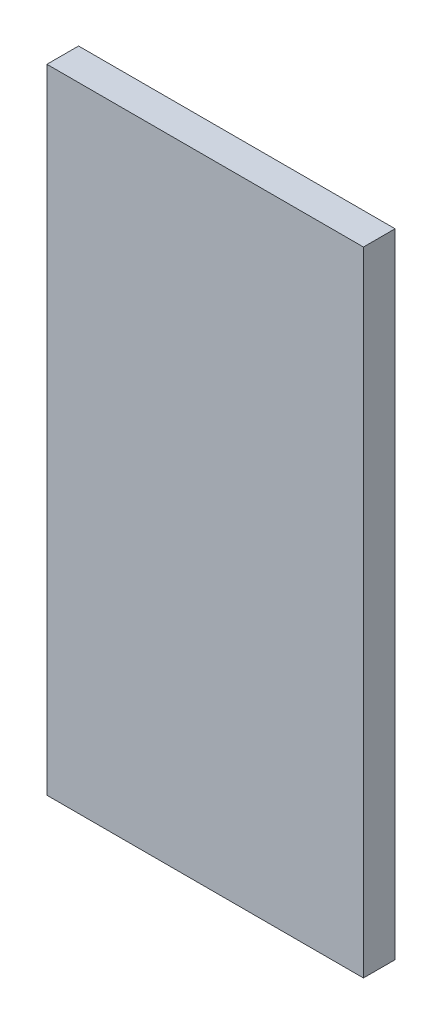
ISO-10303-21;
HEADER;
FILE_DESCRIPTION(('STEP AP214'),'2;1');
FILE_NAME('part.step','',(''),(''),'','','');
FILE_SCHEMA(('AUTOMOTIVE_DESIGN { 1 0 10303 214 1 1 1 1 }'));
ENDSEC;
DATA;
#1=APPLICATION_CONTEXT('core data for automotive mechanical design processes');
#2=APPLICATION_PROTOCOL_DEFINITION('international standard','automotive_design',2000,#1);
#3=PRODUCT_CONTEXT('',#1,'mechanical');
#4=PRODUCT('Part','Part','',(#3));
#5=PRODUCT_RELATED_PRODUCT_CATEGORY('part','',(#4));
#6=PRODUCT_DEFINITION_FORMATION('','',#4);
#7=PRODUCT_DEFINITION_CONTEXT('part definition',#1,'design');
#8=PRODUCT_DEFINITION('design','',#6,#7);
#9=PRODUCT_DEFINITION_SHAPE('','',#8);
#10=(LENGTH_UNIT() NAMED_UNIT(*) SI_UNIT(.MILLI.,.METRE.));
#11=(NAMED_UNIT(*) PLANE_ANGLE_UNIT() SI_UNIT($,.RADIAN.));
#12=(NAMED_UNIT(*) SI_UNIT($,.STERADIAN.) SOLID_ANGLE_UNIT());
#13=UNCERTAINTY_MEASURE_WITH_UNIT(LENGTH_MEASURE(1.E-05),#10,'distance_accuracy_value','');
#14=(GEOMETRIC_REPRESENTATION_CONTEXT(3) GLOBAL_UNCERTAINTY_ASSIGNED_CONTEXT((#13)) GLOBAL_UNIT_ASSIGNED_CONTEXT((#10,
#11,#12)) REPRESENTATION_CONTEXT('',''));
#15=CARTESIAN_POINT('',(0.,0.,0.));
#16=DIRECTION('',(0.,0.,1.));
#17=DIRECTION('',(1.,0.,0.));
#18=AXIS2_PLACEMENT_3D('',#15,#16,#17);
#19=CARTESIAN_POINT('',(50.,-100.,10.));
#20=DIRECTION('',(-1.,0.,0.));
#21=DIRECTION('',(0.,0.,1.));
#22=AXIS2_PLACEMENT_3D('',#19,#20,#21);
#23=PLANE('',#22);
#24=DIRECTION('',(0.,1.,0.));
#25=VECTOR('',#24,1.);
#26=CARTESIAN_POINT('',(50.,-100.,0.));
#27=LINE('',#26,#25);
#28=CARTESIAN_POINT('',(50.,-100.,0.));
#29=VERTEX_POINT('',#28);
#30=CARTESIAN_POINT('',(50.,100.,0.));
#31=VERTEX_POINT('',#30);
#32=EDGE_CURVE('E95',#29,#31,#27,.T.);
#33=ORIENTED_EDGE('',*,*,#32,.T.);
#34=DIRECTION('',(0.,0.,-1.));
#35=VECTOR('',#34,1.);
#36=CARTESIAN_POINT('',(50.,100.,10.));
#37=LINE('',#36,#35);
#38=CARTESIAN_POINT('',(50.,100.,10.));
#39=VERTEX_POINT('',#38);
#40=EDGE_CURVE('E11',#39,#31,#37,.T.);
#41=ORIENTED_EDGE('',*,*,#40,.F.);
#42=DIRECTION('',(0.,1.,0.));
#43=VECTOR('',#42,1.);
#44=CARTESIAN_POINT('',(50.,-100.,10.));
#45=LINE('',#44,#43);
#46=CARTESIAN_POINT('',(50.,-100.,10.));
#47=VERTEX_POINT('',#46);
#48=EDGE_CURVE('E83',#47,#39,#45,.T.);
#49=ORIENTED_EDGE('',*,*,#48,.F.);
#50=DIRECTION('',(0.,0.,-1.));
#51=VECTOR('',#50,1.);
#52=CARTESIAN_POINT('',(50.,-100.,10.));
#53=LINE('',#52,#51);
#54=EDGE_CURVE('E91',#47,#29,#53,.T.);
#55=ORIENTED_EDGE('',*,*,#54,.T.);
#56=EDGE_LOOP('',(#33,#41,#49,#55));
#57=FACE_BOUND('',#56,.T.);
#58=ADVANCED_FACE('F32',(#57),#23,.F.);
#59=CARTESIAN_POINT('',(-50.,100.,10.));
#60=DIRECTION('',(0.,-1.,0.));
#61=DIRECTION('',(0.,0.,-1.));
#62=AXIS2_PLACEMENT_3D('',#59,#60,#61);
#63=PLANE('',#62);
#64=DIRECTION('',(-1.,0.,0.));
#65=VECTOR('',#64,1.);
#66=CARTESIAN_POINT('',(-50.,100.,0.));
#67=LINE('',#66,#65);
#68=CARTESIAN_POINT('',(-50.,100.,0.));
#69=VERTEX_POINT('',#68);
#70=EDGE_CURVE('E87',#31,#69,#67,.T.);
#71=ORIENTED_EDGE('',*,*,#70,.T.);
#72=DIRECTION('',(0.,0.,-1.));
#73=VECTOR('',#72,1.);
#74=CARTESIAN_POINT('',(-50.,100.,10.));
#75=LINE('',#74,#73);
#76=CARTESIAN_POINT('',(-50.,100.,10.));
#77=VERTEX_POINT('',#76);
#78=EDGE_CURVE('E40',#77,#69,#75,.T.);
#79=ORIENTED_EDGE('',*,*,#78,.F.);
#80=DIRECTION('',(-1.,0.,0.));
#81=VECTOR('',#80,1.);
#82=CARTESIAN_POINT('',(-50.,100.,10.));
#83=LINE('',#82,#81);
#84=EDGE_CURVE('E78',#39,#77,#83,.T.);
#85=ORIENTED_EDGE('',*,*,#84,.F.);
#86=ORIENTED_EDGE('',*,*,#40,.T.);
#87=EDGE_LOOP('',(#71,#79,#85,#86));
#88=FACE_BOUND('',#87,.T.);
#89=ADVANCED_FACE('F86',(#88),#63,.F.);
#90=CARTESIAN_POINT('',(-50.,-100.,10.));
#91=DIRECTION('',(1.,0.,0.));
#92=DIRECTION('',(0.,0.,-1.));
#93=AXIS2_PLACEMENT_3D('',#90,#91,#92);
#94=PLANE('',#93);
#95=DIRECTION('',(0.,-1.,0.));
#96=VECTOR('',#95,1.);
#97=CARTESIAN_POINT('',(-50.,-100.,0.));
#98=LINE('',#97,#96);
#99=CARTESIAN_POINT('',(-50.,-100.,0.));
#100=VERTEX_POINT('',#99);
#101=EDGE_CURVE('E65',#69,#100,#98,.T.);
#102=ORIENTED_EDGE('',*,*,#101,.T.);
#103=DIRECTION('',(0.,0.,-1.));
#104=VECTOR('',#103,1.);
#105=CARTESIAN_POINT('',(-50.,-100.,10.));
#106=LINE('',#105,#104);
#107=CARTESIAN_POINT('',(-50.,-100.,10.));
#108=VERTEX_POINT('',#107);
#109=EDGE_CURVE('E88',#108,#100,#106,.T.);
#110=ORIENTED_EDGE('',*,*,#109,.F.);
#111=DIRECTION('',(0.,-1.,0.));
#112=VECTOR('',#111,1.);
#113=CARTESIAN_POINT('',(-50.,-100.,10.));
#114=LINE('',#113,#112);
#115=EDGE_CURVE('E81',#77,#108,#114,.T.);
#116=ORIENTED_EDGE('',*,*,#115,.F.);
#117=ORIENTED_EDGE('',*,*,#78,.T.);
#118=EDGE_LOOP('',(#102,#110,#116,#117));
#119=FACE_BOUND('',#118,.T.);
#120=ADVANCED_FACE('F89',(#119),#94,.F.);
#121=CARTESIAN_POINT('',(-50.,-100.,10.));
#122=DIRECTION('',(0.,1.,0.));
#123=DIRECTION('',(0.,0.,1.));
#124=AXIS2_PLACEMENT_3D('',#121,#122,#123);
#125=PLANE('',#124);
#126=DIRECTION('',(1.,0.,0.));
#127=VECTOR('',#126,1.);
#128=CARTESIAN_POINT('',(-50.,-100.,0.));
#129=LINE('',#128,#127);
#130=EDGE_CURVE('E71',#100,#29,#129,.T.);
#131=ORIENTED_EDGE('',*,*,#130,.T.);
#132=ORIENTED_EDGE('',*,*,#54,.F.);
#133=DIRECTION('',(1.,0.,0.));
#134=VECTOR('',#133,1.);
#135=CARTESIAN_POINT('',(-50.,-100.,10.));
#136=LINE('',#135,#134);
#137=EDGE_CURVE('E48',#108,#47,#136,.T.);
#138=ORIENTED_EDGE('',*,*,#137,.F.);
#139=ORIENTED_EDGE('',*,*,#109,.T.);
#140=EDGE_LOOP('',(#131,#132,#138,#139));
#141=FACE_BOUND('',#140,.T.);
#142=ADVANCED_FACE('F102',(#141),#125,.F.);
#143=CARTESIAN_POINT('',(0.,0.,10.));
#144=DIRECTION('',(0.,0.,-1.));
#145=DIRECTION('',(-1.,0.,0.));
#146=AXIS2_PLACEMENT_3D('',#143,#144,#145);
#147=PLANE('',#146);
#148=ORIENTED_EDGE('',*,*,#48,.T.);
#149=ORIENTED_EDGE('',*,*,#84,.T.);
#150=ORIENTED_EDGE('',*,*,#115,.T.);
#151=ORIENTED_EDGE('',*,*,#137,.T.);
#152=EDGE_LOOP('',(#148,#149,#150,#151));
#153=FACE_BOUND('',#152,.T.);
#154=ADVANCED_FACE('F79',(#153),#147,.F.);
#155=CARTESIAN_POINT('',(0.,0.,0.));
#156=DIRECTION('',(0.,0.,-1.));
#157=DIRECTION('',(-1.,0.,0.));
#158=AXIS2_PLACEMENT_3D('',#155,#156,#157);
#159=PLANE('',#158);
#160=ORIENTED_EDGE('',*,*,#32,.F.);
#161=ORIENTED_EDGE('',*,*,#130,.F.);
#162=ORIENTED_EDGE('',*,*,#101,.F.);
#163=ORIENTED_EDGE('',*,*,#70,.F.);
#164=EDGE_LOOP('',(#160,#161,#162,#163));
#165=FACE_BOUND('',#164,.T.);
#166=ADVANCED_FACE('F105',(#165),#159,.T.);
#167=CLOSED_SHELL('',(#58,#89,#120,#142,#154,#166));
#168=MANIFOLD_SOLID_BREP('B2',#167);
#169=ADVANCED_BREP_SHAPE_REPRESENTATION('',(#18,#168),#14);
#170=SHAPE_DEFINITION_REPRESENTATION(#9,#169);
ENDSEC;
END-ISO-10303-21;
